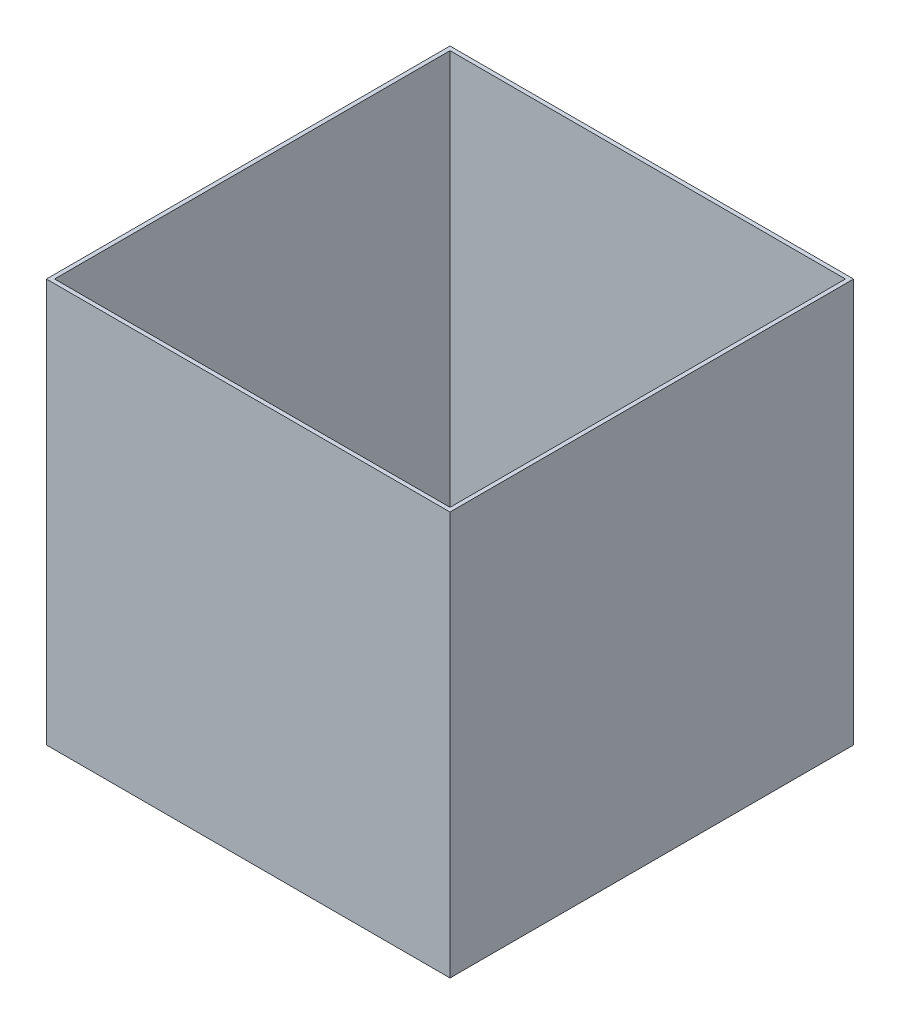
ISO-10303-21;
HEADER;
FILE_DESCRIPTION(('STEP AP214'),'2;1');
FILE_NAME('part.step','',(''),(''),'','','');
FILE_SCHEMA(('AUTOMOTIVE_DESIGN { 1 0 10303 214 1 1 1 1 }'));
ENDSEC;
DATA;
#1=APPLICATION_CONTEXT('core data for automotive mechanical design processes');
#2=APPLICATION_PROTOCOL_DEFINITION('international standard','automotive_design',2000,#1);
#3=PRODUCT_CONTEXT('',#1,'mechanical');
#4=PRODUCT('Part','Part','',(#3));
#5=PRODUCT_RELATED_PRODUCT_CATEGORY('part','',(#4));
#6=PRODUCT_DEFINITION_FORMATION('','',#4);
#7=PRODUCT_DEFINITION_CONTEXT('part definition',#1,'design');
#8=PRODUCT_DEFINITION('design','',#6,#7);
#9=PRODUCT_DEFINITION_SHAPE('','',#8);
#10=(LENGTH_UNIT() NAMED_UNIT(*) SI_UNIT(.MILLI.,.METRE.));
#11=(NAMED_UNIT(*) PLANE_ANGLE_UNIT() SI_UNIT($,.RADIAN.));
#12=(NAMED_UNIT(*) SI_UNIT($,.STERADIAN.) SOLID_ANGLE_UNIT());
#13=UNCERTAINTY_MEASURE_WITH_UNIT(LENGTH_MEASURE(1.E-05),#10,'distance_accuracy_value','');
#14=(GEOMETRIC_REPRESENTATION_CONTEXT(3) GLOBAL_UNCERTAINTY_ASSIGNED_CONTEXT((#13)) GLOBAL_UNIT_ASSIGNED_CONTEXT((#10,
#11,#12)) REPRESENTATION_CONTEXT('',''));
#15=CARTESIAN_POINT('',(0.,0.,0.));
#16=DIRECTION('',(0.,0.,1.));
#17=DIRECTION('',(1.,0.,0.));
#18=AXIS2_PLACEMENT_3D('',#15,#16,#17);
#19=CARTESIAN_POINT('',(0.,200.,0.));
#20=DIRECTION('',(0.,1.,0.));
#21=DIRECTION('',(0.,0.,1.));
#22=AXIS2_PLACEMENT_3D('',#19,#20,#21);
#23=PLANE('',#22);
#24=DIRECTION('',(0.,0.,-1.));
#25=VECTOR('',#24,1.);
#26=CARTESIAN_POINT('',(0.,200.,0.));
#27=LINE('',#26,#25);
#28=CARTESIAN_POINT('',(0.,200.,0.));
#29=VERTEX_POINT('',#28);
#30=CARTESIAN_POINT('',(0.,200.,-200.));
#31=VERTEX_POINT('',#30);
#32=EDGE_CURVE('E136',#29,#31,#27,.T.);
#33=ORIENTED_EDGE('',*,*,#32,.T.);
#34=DIRECTION('',(-1.,0.,0.));
#35=VECTOR('',#34,1.);
#36=CARTESIAN_POINT('',(0.,200.,-200.));
#37=LINE('',#36,#35);
#38=CARTESIAN_POINT('',(-200.,200.,-200.));
#39=VERTEX_POINT('',#38);
#40=EDGE_CURVE('E139',#31,#39,#37,.T.);
#41=ORIENTED_EDGE('',*,*,#40,.T.);
#42=DIRECTION('',(0.,0.,1.));
#43=VECTOR('',#42,1.);
#44=CARTESIAN_POINT('',(-200.,200.,0.));
#45=LINE('',#44,#43);
#46=CARTESIAN_POINT('',(-200.,200.,0.));
#47=VERTEX_POINT('',#46);
#48=EDGE_CURVE('E142',#39,#47,#45,.T.);
#49=ORIENTED_EDGE('',*,*,#48,.T.);
#50=DIRECTION('',(1.,0.,0.));
#51=VECTOR('',#50,1.);
#52=CARTESIAN_POINT('',(0.,200.,0.));
#53=LINE('',#52,#51);
#54=EDGE_CURVE('E144',#47,#29,#53,.T.);
#55=ORIENTED_EDGE('',*,*,#54,.T.);
#56=EDGE_LOOP('',(#33,#41,#49,#55));
#57=FACE_BOUND('',#56,.T.);
#58=DIRECTION('',(1.,0.,0.));
#59=VECTOR('',#58,1.);
#60=CARTESIAN_POINT('',(-198.,200.,-1.99999999999997));
#61=LINE('',#60,#59);
#62=CARTESIAN_POINT('',(-198.,200.,-1.99999999999997));
#63=VERTEX_POINT('',#62);
#64=CARTESIAN_POINT('',(-1.99999999999998,200.,-1.99999999999997));
#65=VERTEX_POINT('',#64);
#66=EDGE_CURVE('E108',#63,#65,#61,.T.);
#67=ORIENTED_EDGE('',*,*,#66,.F.);
#68=DIRECTION('',(0.,0.,1.));
#69=VECTOR('',#68,1.);
#70=CARTESIAN_POINT('',(-198.,200.,-198.));
#71=LINE('',#70,#69);
#72=CARTESIAN_POINT('',(-198.,200.,-198.));
#73=VERTEX_POINT('',#72);
#74=EDGE_CURVE('E100',#73,#63,#71,.T.);
#75=ORIENTED_EDGE('',*,*,#74,.F.);
#76=DIRECTION('',(-1.,0.,0.));
#77=VECTOR('',#76,1.);
#78=CARTESIAN_POINT('',(-198.,200.,-198.));
#79=LINE('',#78,#77);
#80=CARTESIAN_POINT('',(-2.,200.,-198.));
#81=VERTEX_POINT('',#80);
#82=EDGE_CURVE('E122',#81,#73,#79,.T.);
#83=ORIENTED_EDGE('',*,*,#82,.F.);
#84=DIRECTION('',(0.,0.,-1.));
#85=VECTOR('',#84,1.);
#86=CARTESIAN_POINT('',(-2.,200.,-198.));
#87=LINE('',#86,#85);
#88=EDGE_CURVE('E120',#65,#81,#87,.T.);
#89=ORIENTED_EDGE('',*,*,#88,.F.);
#90=EDGE_LOOP('',(#67,#75,#83,#89));
#91=FACE_BOUND('',#90,.T.);
#92=ADVANCED_FACE('F35',(#57,#91),#23,.T.);
#93=CARTESIAN_POINT('',(0.,0.,0.));
#94=DIRECTION('',(0.,1.,0.));
#95=DIRECTION('',(0.,0.,1.));
#96=AXIS2_PLACEMENT_3D('',#93,#94,#95);
#97=PLANE('',#96);
#98=DIRECTION('',(0.,0.,-1.));
#99=VECTOR('',#98,1.);
#100=CARTESIAN_POINT('',(0.,0.,0.));
#101=LINE('',#100,#99);
#102=CARTESIAN_POINT('',(0.,0.,0.));
#103=VERTEX_POINT('',#102);
#104=CARTESIAN_POINT('',(0.,0.,-200.));
#105=VERTEX_POINT('',#104);
#106=EDGE_CURVE('E116',#103,#105,#101,.T.);
#107=ORIENTED_EDGE('',*,*,#106,.F.);
#108=DIRECTION('',(1.,0.,0.));
#109=VECTOR('',#108,1.);
#110=CARTESIAN_POINT('',(0.,0.,0.));
#111=LINE('',#110,#109);
#112=CARTESIAN_POINT('',(-200.,0.,0.));
#113=VERTEX_POINT('',#112);
#114=EDGE_CURVE('E140',#113,#103,#111,.T.);
#115=ORIENTED_EDGE('',*,*,#114,.F.);
#116=DIRECTION('',(0.,0.,1.));
#117=VECTOR('',#116,1.);
#118=CARTESIAN_POINT('',(-200.,0.,0.));
#119=LINE('',#118,#117);
#120=CARTESIAN_POINT('',(-200.,0.,-200.));
#121=VERTEX_POINT('',#120);
#122=EDGE_CURVE('E151',#121,#113,#119,.T.);
#123=ORIENTED_EDGE('',*,*,#122,.F.);
#124=DIRECTION('',(-1.,0.,0.));
#125=VECTOR('',#124,1.);
#126=CARTESIAN_POINT('',(0.,0.,-200.));
#127=LINE('',#126,#125);
#128=EDGE_CURVE('E149',#105,#121,#127,.T.);
#129=ORIENTED_EDGE('',*,*,#128,.F.);
#130=EDGE_LOOP('',(#107,#115,#123,#129));
#131=FACE_BOUND('',#130,.T.);
#132=DIRECTION('',(0.,0.,1.));
#133=VECTOR('',#132,1.);
#134=CARTESIAN_POINT('',(-198.,0.,-198.));
#135=LINE('',#134,#133);
#136=CARTESIAN_POINT('',(-198.,0.,-198.));
#137=VERTEX_POINT('',#136);
#138=CARTESIAN_POINT('',(-198.,0.,-1.99999999999997));
#139=VERTEX_POINT('',#138);
#140=EDGE_CURVE('E58',#137,#139,#135,.T.);
#141=ORIENTED_EDGE('',*,*,#140,.T.);
#142=DIRECTION('',(1.,0.,0.));
#143=VECTOR('',#142,1.);
#144=CARTESIAN_POINT('',(-198.,0.,-1.99999999999997));
#145=LINE('',#144,#143);
#146=CARTESIAN_POINT('',(-1.99999999999998,0.,-1.99999999999997));
#147=VERTEX_POINT('',#146);
#148=EDGE_CURVE('E115',#139,#147,#145,.T.);
#149=ORIENTED_EDGE('',*,*,#148,.T.);
#150=DIRECTION('',(0.,0.,-1.));
#151=VECTOR('',#150,1.);
#152=CARTESIAN_POINT('',(-2.,0.,-198.));
#153=LINE('',#152,#151);
#154=CARTESIAN_POINT('',(-2.,0.,-198.));
#155=VERTEX_POINT('',#154);
#156=EDGE_CURVE('E128',#147,#155,#153,.T.);
#157=ORIENTED_EDGE('',*,*,#156,.T.);
#158=DIRECTION('',(-1.,0.,0.));
#159=VECTOR('',#158,1.);
#160=CARTESIAN_POINT('',(-198.,0.,-198.));
#161=LINE('',#160,#159);
#162=EDGE_CURVE('E109',#155,#137,#161,.T.);
#163=ORIENTED_EDGE('',*,*,#162,.T.);
#164=EDGE_LOOP('',(#141,#149,#157,#163));
#165=FACE_BOUND('',#164,.T.);
#166=ADVANCED_FACE('F169',(#131,#165),#97,.F.);
#167=CARTESIAN_POINT('',(0.,200.,0.));
#168=DIRECTION('',(-1.,0.,0.));
#169=DIRECTION('',(0.,0.,1.));
#170=AXIS2_PLACEMENT_3D('',#167,#168,#169);
#171=PLANE('',#170);
#172=ORIENTED_EDGE('',*,*,#106,.T.);
#173=DIRECTION('',(0.,-1.,0.));
#174=VECTOR('',#173,1.);
#175=CARTESIAN_POINT('',(0.,200.,-200.));
#176=LINE('',#175,#174);
#177=EDGE_CURVE('E11',#31,#105,#176,.T.);
#178=ORIENTED_EDGE('',*,*,#177,.F.);
#179=ORIENTED_EDGE('',*,*,#32,.F.);
#180=DIRECTION('',(0.,-1.,0.));
#181=VECTOR('',#180,1.);
#182=CARTESIAN_POINT('',(0.,200.,0.));
#183=LINE('',#182,#181);
#184=EDGE_CURVE('E146',#29,#103,#183,.T.);
#185=ORIENTED_EDGE('',*,*,#184,.T.);
#186=EDGE_LOOP('',(#172,#178,#179,#185));
#187=FACE_BOUND('',#186,.T.);
#188=ADVANCED_FACE('F37',(#187),#171,.F.);
#189=CARTESIAN_POINT('',(0.,200.,-200.));
#190=DIRECTION('',(0.,0.,1.));
#191=DIRECTION('',(1.,0.,0.));
#192=AXIS2_PLACEMENT_3D('',#189,#190,#191);
#193=PLANE('',#192);
#194=ORIENTED_EDGE('',*,*,#128,.T.);
#195=DIRECTION('',(0.,-1.,0.));
#196=VECTOR('',#195,1.);
#197=CARTESIAN_POINT('',(-200.,200.,-200.));
#198=LINE('',#197,#196);
#199=EDGE_CURVE('E43',#39,#121,#198,.T.);
#200=ORIENTED_EDGE('',*,*,#199,.F.);
#201=ORIENTED_EDGE('',*,*,#40,.F.);
#202=ORIENTED_EDGE('',*,*,#177,.T.);
#203=EDGE_LOOP('',(#194,#200,#201,#202));
#204=FACE_BOUND('',#203,.T.);
#205=ADVANCED_FACE('F179',(#204),#193,.F.);
#206=CARTESIAN_POINT('',(-200.,200.,0.));
#207=DIRECTION('',(1.,0.,0.));
#208=DIRECTION('',(0.,0.,-1.));
#209=AXIS2_PLACEMENT_3D('',#206,#207,#208);
#210=PLANE('',#209);
#211=ORIENTED_EDGE('',*,*,#122,.T.);
#212=DIRECTION('',(0.,-1.,0.));
#213=VECTOR('',#212,1.);
#214=CARTESIAN_POINT('',(-200.,200.,0.));
#215=LINE('',#214,#213);
#216=EDGE_CURVE('E156',#47,#113,#215,.T.);
#217=ORIENTED_EDGE('',*,*,#216,.F.);
#218=ORIENTED_EDGE('',*,*,#48,.F.);
#219=ORIENTED_EDGE('',*,*,#199,.T.);
#220=EDGE_LOOP('',(#211,#217,#218,#219));
#221=FACE_BOUND('',#220,.T.);
#222=ADVANCED_FACE('F163',(#221),#210,.F.);
#223=CARTESIAN_POINT('',(0.,200.,0.));
#224=DIRECTION('',(0.,0.,-1.));
#225=DIRECTION('',(-1.,0.,0.));
#226=AXIS2_PLACEMENT_3D('',#223,#224,#225);
#227=PLANE('',#226);
#228=ORIENTED_EDGE('',*,*,#114,.T.);
#229=ORIENTED_EDGE('',*,*,#184,.F.);
#230=ORIENTED_EDGE('',*,*,#54,.F.);
#231=ORIENTED_EDGE('',*,*,#216,.T.);
#232=EDGE_LOOP('',(#228,#229,#230,#231));
#233=FACE_BOUND('',#232,.T.);
#234=ADVANCED_FACE('F173',(#233),#227,.F.);
#235=CARTESIAN_POINT('',(-198.,200.,-198.));
#236=DIRECTION('',(1.,0.,0.));
#237=DIRECTION('',(0.,0.,-1.));
#238=AXIS2_PLACEMENT_3D('',#235,#236,#237);
#239=PLANE('',#238);
#240=ORIENTED_EDGE('',*,*,#140,.F.);
#241=DIRECTION('',(0.,-1.,0.));
#242=VECTOR('',#241,1.);
#243=CARTESIAN_POINT('',(-198.,200.,-198.));
#244=LINE('',#243,#242);
#245=EDGE_CURVE('E104',#73,#137,#244,.T.);
#246=ORIENTED_EDGE('',*,*,#245,.F.);
#247=ORIENTED_EDGE('',*,*,#74,.T.);
#248=DIRECTION('',(0.,-1.,0.));
#249=VECTOR('',#248,1.);
#250=CARTESIAN_POINT('',(-198.,200.,-1.99999999999997));
#251=LINE('',#250,#249);
#252=EDGE_CURVE('E103',#63,#139,#251,.T.);
#253=ORIENTED_EDGE('',*,*,#252,.T.);
#254=EDGE_LOOP('',(#240,#246,#247,#253));
#255=FACE_BOUND('',#254,.T.);
#256=ADVANCED_FACE('F102',(#255),#239,.T.);
#257=CARTESIAN_POINT('',(-198.,200.,-1.99999999999997));
#258=DIRECTION('',(0.,0.,-1.));
#259=DIRECTION('',(-1.,0.,0.));
#260=AXIS2_PLACEMENT_3D('',#257,#258,#259);
#261=PLANE('',#260);
#262=ORIENTED_EDGE('',*,*,#148,.F.);
#263=ORIENTED_EDGE('',*,*,#252,.F.);
#264=ORIENTED_EDGE('',*,*,#66,.T.);
#265=DIRECTION('',(0.,-1.,0.));
#266=VECTOR('',#265,1.);
#267=CARTESIAN_POINT('',(-1.99999999999998,200.,-1.99999999999997));
#268=LINE('',#267,#266);
#269=EDGE_CURVE('E117',#65,#147,#268,.T.);
#270=ORIENTED_EDGE('',*,*,#269,.T.);
#271=EDGE_LOOP('',(#262,#263,#264,#270));
#272=FACE_BOUND('',#271,.T.);
#273=ADVANCED_FACE('F112',(#272),#261,.T.);
#274=CARTESIAN_POINT('',(-2.,200.,-198.));
#275=DIRECTION('',(-1.,0.,0.));
#276=DIRECTION('',(0.,0.,1.));
#277=AXIS2_PLACEMENT_3D('',#274,#275,#276);
#278=PLANE('',#277);
#279=ORIENTED_EDGE('',*,*,#156,.F.);
#280=ORIENTED_EDGE('',*,*,#269,.F.);
#281=ORIENTED_EDGE('',*,*,#88,.T.);
#282=DIRECTION('',(0.,-1.,0.));
#283=VECTOR('',#282,1.);
#284=CARTESIAN_POINT('',(-2.,200.,-198.));
#285=LINE('',#284,#283);
#286=EDGE_CURVE('E50',#81,#155,#285,.T.);
#287=ORIENTED_EDGE('',*,*,#286,.T.);
#288=EDGE_LOOP('',(#279,#280,#281,#287));
#289=FACE_BOUND('',#288,.T.);
#290=ADVANCED_FACE('F202',(#289),#278,.T.);
#291=CARTESIAN_POINT('',(-198.,200.,-198.));
#292=DIRECTION('',(0.,0.,1.));
#293=DIRECTION('',(1.,0.,0.));
#294=AXIS2_PLACEMENT_3D('',#291,#292,#293);
#295=PLANE('',#294);
#296=ORIENTED_EDGE('',*,*,#162,.F.);
#297=ORIENTED_EDGE('',*,*,#286,.F.);
#298=ORIENTED_EDGE('',*,*,#82,.T.);
#299=ORIENTED_EDGE('',*,*,#245,.T.);
#300=EDGE_LOOP('',(#296,#297,#298,#299));
#301=FACE_BOUND('',#300,.T.);
#302=ADVANCED_FACE('F206',(#301),#295,.T.);
#303=CLOSED_SHELL('',(#92,#166,#188,#205,#222,#234,#256,#273,#290,#302));
#304=MANIFOLD_SOLID_BREP('B2',#303);
#305=ADVANCED_BREP_SHAPE_REPRESENTATION('',(#18,#304),#14);
#306=SHAPE_DEFINITION_REPRESENTATION(#9,#305);
ENDSEC;
END-ISO-10303-21;
